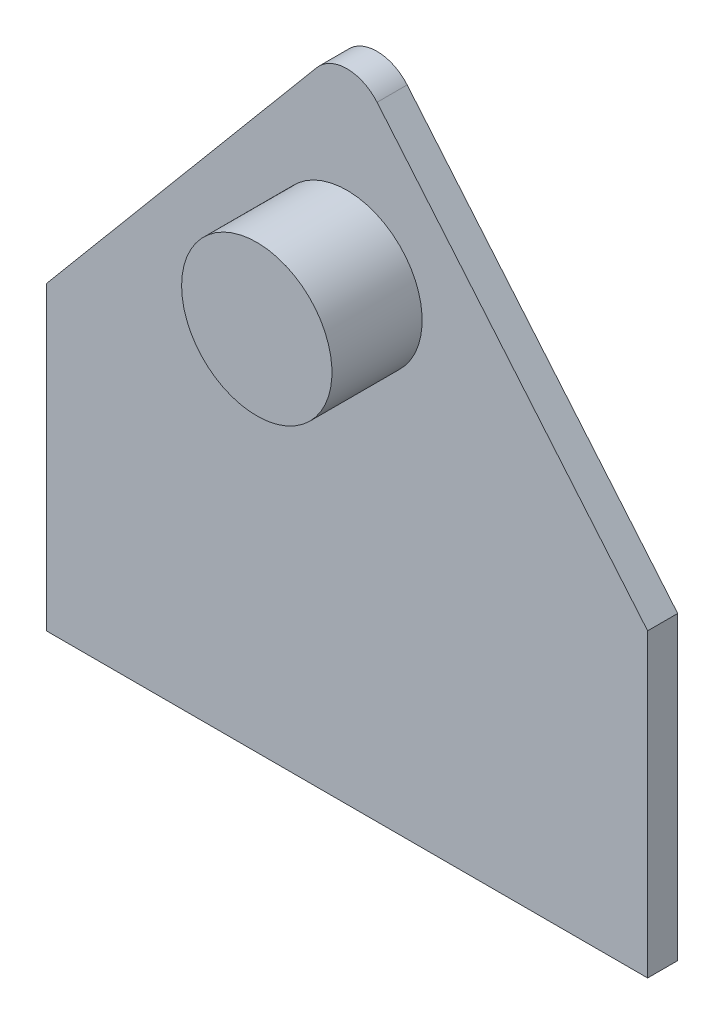
ISO-10303-21;
HEADER;
FILE_DESCRIPTION(('STEP AP214'),'2;1');
FILE_NAME('part.step','',(''),(''),'','','');
FILE_SCHEMA(('AUTOMOTIVE_DESIGN { 1 0 10303 214 1 1 1 1 }'));
ENDSEC;
DATA;
#1=APPLICATION_CONTEXT('core data for automotive mechanical design processes');
#2=APPLICATION_PROTOCOL_DEFINITION('international standard','automotive_design',2000,#1);
#3=PRODUCT_CONTEXT('',#1,'mechanical');
#4=PRODUCT('Part','Part','',(#3));
#5=PRODUCT_RELATED_PRODUCT_CATEGORY('part','',(#4));
#6=PRODUCT_DEFINITION_FORMATION('','',#4);
#7=PRODUCT_DEFINITION_CONTEXT('part definition',#1,'design');
#8=PRODUCT_DEFINITION('design','',#6,#7);
#9=PRODUCT_DEFINITION_SHAPE('','',#8);
#10=(LENGTH_UNIT() NAMED_UNIT(*) SI_UNIT(.MILLI.,.METRE.));
#11=(NAMED_UNIT(*) PLANE_ANGLE_UNIT() SI_UNIT($,.RADIAN.));
#12=(NAMED_UNIT(*) SI_UNIT($,.STERADIAN.) SOLID_ANGLE_UNIT());
#13=UNCERTAINTY_MEASURE_WITH_UNIT(LENGTH_MEASURE(1.E-05),#10,'distance_accuracy_value','');
#14=(GEOMETRIC_REPRESENTATION_CONTEXT(3) GLOBAL_UNCERTAINTY_ASSIGNED_CONTEXT((#13)) GLOBAL_UNIT_ASSIGNED_CONTEXT((#10,
#11,#12)) REPRESENTATION_CONTEXT('',''));
#15=CARTESIAN_POINT('',(0.,0.,0.));
#16=DIRECTION('',(0.,0.,1.));
#17=DIRECTION('',(1.,0.,0.));
#18=AXIS2_PLACEMENT_3D('',#15,#16,#17);
#19=CARTESIAN_POINT('',(15.2005666401944,0.,1.27));
#20=DIRECTION('',(0.,1.,0.));
#21=DIRECTION('',(-1.,0.,0.));
#22=AXIS2_PLACEMENT_3D('',#19,#20,#21);
#23=PLANE('',#22);
#24=DIRECTION('',(1.,0.,0.));
#25=VECTOR('',#24,1.);
#26=CARTESIAN_POINT('',(15.2005666401944,0.,0.));
#27=LINE('',#26,#25);
#28=CARTESIAN_POINT('',(-10.1994333598056,0.,0.));
#29=VERTEX_POINT('',#28);
#30=CARTESIAN_POINT('',(15.2005666401944,0.,0.));
#31=VERTEX_POINT('',#30);
#32=EDGE_CURVE('E141',#29,#31,#27,.T.);
#33=ORIENTED_EDGE('',*,*,#32,.T.);
#34=DIRECTION('',(0.,0.,-1.));
#35=VECTOR('',#34,1.);
#36=CARTESIAN_POINT('',(15.2005666401944,0.,1.27));
#37=LINE('',#36,#35);
#38=CARTESIAN_POINT('',(15.2005666401944,0.,1.27));
#39=VERTEX_POINT('',#38);
#40=EDGE_CURVE('E47',#39,#31,#37,.T.);
#41=ORIENTED_EDGE('',*,*,#40,.F.);
#42=DIRECTION('',(1.,0.,0.));
#43=VECTOR('',#42,1.);
#44=CARTESIAN_POINT('',(15.2005666401944,0.,1.27));
#45=LINE('',#44,#43);
#46=CARTESIAN_POINT('',(-10.1994333598056,0.,1.27));
#47=VERTEX_POINT('',#46);
#48=EDGE_CURVE('E158',#47,#39,#45,.T.);
#49=ORIENTED_EDGE('',*,*,#48,.F.);
#50=DIRECTION('',(0.,0.,-1.));
#51=VECTOR('',#50,1.);
#52=CARTESIAN_POINT('',(-10.1994333598056,0.,1.27));
#53=LINE('',#52,#51);
#54=EDGE_CURVE('E137',#47,#29,#53,.T.);
#55=ORIENTED_EDGE('',*,*,#54,.T.);
#56=EDGE_LOOP('',(#33,#41,#49,#55));
#57=FACE_BOUND('',#56,.T.);
#58=ADVANCED_FACE('F38',(#57),#23,.F.);
#59=CARTESIAN_POINT('',(15.2005666401944,12.7,1.27));
#60=DIRECTION('',(-1.,0.,0.));
#61=DIRECTION('',(0.,0.,1.));
#62=AXIS2_PLACEMENT_3D('',#59,#60,#61);
#63=PLANE('',#62);
#64=DIRECTION('',(0.,1.,0.));
#65=VECTOR('',#64,1.);
#66=CARTESIAN_POINT('',(15.2005666401944,12.7,0.));
#67=LINE('',#66,#65);
#68=CARTESIAN_POINT('',(15.2005666401944,12.7,0.));
#69=VERTEX_POINT('',#68);
#70=EDGE_CURVE('E145',#31,#69,#67,.T.);
#71=ORIENTED_EDGE('',*,*,#70,.T.);
#72=DIRECTION('',(0.,0.,-1.));
#73=VECTOR('',#72,1.);
#74=CARTESIAN_POINT('',(15.2005666401944,12.7,1.27));
#75=LINE('',#74,#73);
#76=CARTESIAN_POINT('',(15.2005666401944,12.7,1.27));
#77=VERTEX_POINT('',#76);
#78=EDGE_CURVE('E165',#77,#69,#75,.T.);
#79=ORIENTED_EDGE('',*,*,#78,.F.);
#80=DIRECTION('',(0.,1.,0.));
#81=VECTOR('',#80,1.);
#82=CARTESIAN_POINT('',(15.2005666401944,12.7,1.27));
#83=LINE('',#82,#81);
#84=EDGE_CURVE('E104',#39,#77,#83,.T.);
#85=ORIENTED_EDGE('',*,*,#84,.F.);
#86=ORIENTED_EDGE('',*,*,#40,.T.);
#87=EDGE_LOOP('',(#71,#79,#85,#86));
#88=FACE_BOUND('',#87,.T.);
#89=ADVANCED_FACE('F171',(#88),#63,.F.);
#90=CARTESIAN_POINT('',(3.77180293996771,26.3202701986554,1.27));
#91=DIRECTION('',(-0.766044443118977,-0.642787609686541,0.));
#92=DIRECTION('',(0.642787609686541,-0.766044443118977,0.));
#93=AXIS2_PLACEMENT_3D('',#90,#91,#92);
#94=PLANE('',#93);
#95=DIRECTION('',(-0.642787609686541,0.766044443118977,0.));
#96=VECTOR('',#95,1.);
#97=CARTESIAN_POINT('',(3.77180293996771,26.3202701986554,0.));
#98=LINE('',#97,#96);
#99=CARTESIAN_POINT('',(3.77180293996771,26.3202701986554,0.));
#100=VERTEX_POINT('',#99);
#101=EDGE_CURVE('E149',#69,#100,#98,.T.);
#102=ORIENTED_EDGE('',*,*,#101,.T.);
#103=DIRECTION('',(0.,0.,-1.));
#104=VECTOR('',#103,1.);
#105=CARTESIAN_POINT('',(3.77180293996771,26.3202701986554,1.27));
#106=LINE('',#105,#104);
#107=CARTESIAN_POINT('',(3.77180293996771,26.3202701986554,1.27));
#108=VERTEX_POINT('',#107);
#109=EDGE_CURVE('E129',#108,#100,#106,.T.);
#110=ORIENTED_EDGE('',*,*,#109,.F.);
#111=DIRECTION('',(-0.642787609686541,0.766044443118977,0.));
#112=VECTOR('',#111,1.);
#113=CARTESIAN_POINT('',(3.77180293996771,26.3202701986554,1.27));
#114=LINE('',#113,#112);
#115=EDGE_CURVE('E118',#77,#108,#114,.T.);
#116=ORIENTED_EDGE('',*,*,#115,.F.);
#117=ORIENTED_EDGE('',*,*,#78,.T.);
#118=EDGE_LOOP('',(#102,#110,#116,#117));
#119=FACE_BOUND('',#118,.T.);
#120=ADVANCED_FACE('F179',(#119),#94,.F.);
#121=CARTESIAN_POINT('',(2.5005666401944,25.2535762883765,1.27));
#122=DIRECTION('',(0.,0.,-1.));
#123=DIRECTION('',(-1.,0.,0.));
#124=AXIS2_PLACEMENT_3D('',#121,#122,#123);
#125=CYLINDRICAL_SURFACE('',#124,1.65948113218787);
#126=CARTESIAN_POINT('',(2.5005666401944,25.2535762883765,0.));
#127=DIRECTION('',(0.,0.,1.));
#128=DIRECTION('',(-1.,0.,0.));
#129=AXIS2_PLACEMENT_3D('',#126,#127,#128);
#130=CIRCLE('',#129,1.65948113218787);
#131=CARTESIAN_POINT('',(1.22933034042109,26.3202701986554,0.));
#132=VERTEX_POINT('',#131);
#133=EDGE_CURVE('E127',#100,#132,#130,.T.);
#134=ORIENTED_EDGE('',*,*,#133,.T.);
#135=DIRECTION('',(0.,0.,-1.));
#136=VECTOR('',#135,1.);
#137=CARTESIAN_POINT('',(1.22933034042109,26.3202701986554,1.27));
#138=LINE('',#137,#136);
#139=CARTESIAN_POINT('',(1.22933034042109,26.3202701986554,1.27));
#140=VERTEX_POINT('',#139);
#141=EDGE_CURVE('E124',#140,#132,#138,.T.);
#142=ORIENTED_EDGE('',*,*,#141,.F.);
#143=CARTESIAN_POINT('',(2.5005666401944,25.2535762883765,1.27));
#144=DIRECTION('',(0.,0.,1.));
#145=DIRECTION('',(-1.,0.,0.));
#146=AXIS2_PLACEMENT_3D('',#143,#144,#145);
#147=CIRCLE('',#146,1.65948113218787);
#148=EDGE_CURVE('E112',#108,#140,#147,.T.);
#149=ORIENTED_EDGE('',*,*,#148,.F.);
#150=ORIENTED_EDGE('',*,*,#109,.T.);
#151=EDGE_LOOP('',(#134,#142,#149,#150));
#152=FACE_BOUND('',#151,.T.);
#153=ADVANCED_FACE('F125',(#152),#125,.T.);
#154=CARTESIAN_POINT('',(-10.1994333598056,12.7,1.27));
#155=DIRECTION('',(0.766044443118977,-0.64278760968654,0.));
#156=DIRECTION('',(0.64278760968654,0.766044443118977,0.));
#157=AXIS2_PLACEMENT_3D('',#154,#155,#156);
#158=PLANE('',#157);
#159=DIRECTION('',(-0.64278760968654,-0.766044443118977,0.));
#160=VECTOR('',#159,1.);
#161=CARTESIAN_POINT('',(-10.1994333598056,12.7,0.));
#162=LINE('',#161,#160);
#163=CARTESIAN_POINT('',(-10.1994333598056,12.7,0.));
#164=VERTEX_POINT('',#163);
#165=EDGE_CURVE('E87',#132,#164,#162,.T.);
#166=ORIENTED_EDGE('',*,*,#165,.T.);
#167=DIRECTION('',(0.,0.,-1.));
#168=VECTOR('',#167,1.);
#169=CARTESIAN_POINT('',(-10.1994333598056,12.7,1.27));
#170=LINE('',#169,#168);
#171=CARTESIAN_POINT('',(-10.1994333598056,12.7,1.27));
#172=VERTEX_POINT('',#171);
#173=EDGE_CURVE('E130',#172,#164,#170,.T.);
#174=ORIENTED_EDGE('',*,*,#173,.F.);
#175=DIRECTION('',(-0.64278760968654,-0.766044443118977,0.));
#176=VECTOR('',#175,1.);
#177=CARTESIAN_POINT('',(-10.1994333598056,12.7,1.27));
#178=LINE('',#177,#176);
#179=EDGE_CURVE('E116',#140,#172,#178,.T.);
#180=ORIENTED_EDGE('',*,*,#179,.F.);
#181=ORIENTED_EDGE('',*,*,#141,.T.);
#182=EDGE_LOOP('',(#166,#174,#180,#181));
#183=FACE_BOUND('',#182,.T.);
#184=ADVANCED_FACE('F132',(#183),#158,.F.);
#185=CARTESIAN_POINT('',(-10.1994333598056,0.,1.27));
#186=DIRECTION('',(1.,0.,0.));
#187=DIRECTION('',(0.,0.,-1.));
#188=AXIS2_PLACEMENT_3D('',#185,#186,#187);
#189=PLANE('',#188);
#190=DIRECTION('',(0.,-1.,0.));
#191=VECTOR('',#190,1.);
#192=CARTESIAN_POINT('',(-10.1994333598056,0.,0.));
#193=LINE('',#192,#191);
#194=EDGE_CURVE('E93',#164,#29,#193,.T.);
#195=ORIENTED_EDGE('',*,*,#194,.T.);
#196=ORIENTED_EDGE('',*,*,#54,.F.);
#197=DIRECTION('',(0.,-1.,0.));
#198=VECTOR('',#197,1.);
#199=CARTESIAN_POINT('',(-10.1994333598056,0.,1.27));
#200=LINE('',#199,#198);
#201=EDGE_CURVE('E57',#172,#47,#200,.T.);
#202=ORIENTED_EDGE('',*,*,#201,.F.);
#203=ORIENTED_EDGE('',*,*,#173,.T.);
#204=EDGE_LOOP('',(#195,#196,#202,#203));
#205=FACE_BOUND('',#204,.T.);
#206=ADVANCED_FACE('F197',(#205),#189,.F.);
#207=CARTESIAN_POINT('',(2.5005666401944,25.2535762883765,1.27));
#208=DIRECTION('',(0.,0.,-1.));
#209=DIRECTION('',(-1.,0.,0.));
#210=AXIS2_PLACEMENT_3D('',#207,#208,#209);
#211=PLANE('',#210);
#212=CARTESIAN_POINT('',(2.5005666401944,19.2930574205643,1.27));
#213=DIRECTION('',(0.,0.,-1.));
#214=DIRECTION('',(-1.,0.,0.));
#215=AXIS2_PLACEMENT_3D('',#212,#213,#214);
#216=CIRCLE('',#215,3.175);
#217=CARTESIAN_POINT('',(-0.674433359805603,19.2930574205643,1.27));
#218=VERTEX_POINT('',#217);
#219=EDGE_CURVE('E11',#218,#218,#216,.F.);
#220=ORIENTED_EDGE('',*,*,#219,.F.);
#221=EDGE_LOOP('',(#220));
#222=FACE_BOUND('',#221,.T.);
#223=ORIENTED_EDGE('',*,*,#48,.T.);
#224=ORIENTED_EDGE('',*,*,#84,.T.);
#225=ORIENTED_EDGE('',*,*,#115,.T.);
#226=ORIENTED_EDGE('',*,*,#148,.T.);
#227=ORIENTED_EDGE('',*,*,#179,.T.);
#228=ORIENTED_EDGE('',*,*,#201,.T.);
#229=EDGE_LOOP('',(#223,#224,#225,#226,#227,#228));
#230=FACE_BOUND('',#229,.T.);
#231=ADVANCED_FACE('F114',(#222,#230),#211,.F.);
#232=CARTESIAN_POINT('',(2.5005666401944,25.2535762883765,0.));
#233=DIRECTION('',(0.,0.,-1.));
#234=DIRECTION('',(-1.,0.,0.));
#235=AXIS2_PLACEMENT_3D('',#232,#233,#234);
#236=PLANE('',#235);
#237=ORIENTED_EDGE('',*,*,#32,.F.);
#238=ORIENTED_EDGE('',*,*,#194,.F.);
#239=ORIENTED_EDGE('',*,*,#165,.F.);
#240=ORIENTED_EDGE('',*,*,#133,.F.);
#241=ORIENTED_EDGE('',*,*,#101,.F.);
#242=ORIENTED_EDGE('',*,*,#70,.F.);
#243=EDGE_LOOP('',(#237,#238,#239,#240,#241,#242));
#244=FACE_BOUND('',#243,.T.);
#245=ADVANCED_FACE('F176',(#244),#236,.T.);
#246=CARTESIAN_POINT('',(2.5005666401944,19.2930574205643,5.08));
#247=DIRECTION('',(0.,0.,-1.));
#248=DIRECTION('',(-1.,0.,0.));
#249=AXIS2_PLACEMENT_3D('',#246,#247,#248);
#250=CYLINDRICAL_SURFACE('',#249,3.175);
#251=CARTESIAN_POINT('',(2.5005666401944,19.2930574205643,5.08));
#252=DIRECTION('',(0.,0.,1.));
#253=DIRECTION('',(1.,0.,0.));
#254=AXIS2_PLACEMENT_3D('',#251,#252,#253);
#255=CIRCLE('',#254,3.175);
#256=CARTESIAN_POINT('',(-0.674433359805603,19.2930574205643,5.08));
#257=VERTEX_POINT('',#256);
#258=EDGE_CURVE('E146',#257,#257,#255,.T.);
#259=CARTESIAN_POINT('',(-0.674433359805603,19.2930574205643,5.08));
#260=CARTESIAN_POINT('',(-0.674433359805603,19.2930574205643,5.0403125));
#261=CARTESIAN_POINT('',(-0.674433359805603,19.2930574205643,5.000625));
#262=CARTESIAN_POINT('',(-0.674433359805603,19.2930574205643,4.92125));
#263=CARTESIAN_POINT('',(-0.674433359805603,19.2930574205643,4.8815625));
#264=CARTESIAN_POINT('',(-0.674433359805603,19.2930574205643,4.8021875));
#265=CARTESIAN_POINT('',(-0.674433359805603,19.2930574205643,4.7625));
#266=CARTESIAN_POINT('',(-0.674433359805603,19.2930574205643,4.683125));
#267=CARTESIAN_POINT('',(-0.674433359805603,19.2930574205643,4.6434375));
#268=CARTESIAN_POINT('',(-0.674433359805603,19.2930574205643,4.5640625));
#269=CARTESIAN_POINT('',(-0.674433359805603,19.2930574205643,4.524375));
#270=CARTESIAN_POINT('',(-0.674433359805603,19.2930574205643,4.445));
#271=CARTESIAN_POINT('',(-0.674433359805603,19.2930574205643,4.4053125));
#272=CARTESIAN_POINT('',(-0.674433359805603,19.2930574205643,4.3259375));
#273=CARTESIAN_POINT('',(-0.674433359805603,19.2930574205643,4.28625));
#274=CARTESIAN_POINT('',(-0.674433359805603,19.2930574205643,4.206875));
#275=CARTESIAN_POINT('',(-0.674433359805603,19.2930574205643,4.1671875));
#276=CARTESIAN_POINT('',(-0.674433359805603,19.2930574205643,4.0878125));
#277=CARTESIAN_POINT('',(-0.674433359805603,19.2930574205643,4.048125));
#278=CARTESIAN_POINT('',(-0.674433359805603,19.2930574205643,3.96875));
#279=CARTESIAN_POINT('',(-0.674433359805603,19.2930574205643,3.9290625));
#280=CARTESIAN_POINT('',(-0.674433359805603,19.2930574205643,3.8496875));
#281=CARTESIAN_POINT('',(-0.674433359805603,19.2930574205643,3.81));
#282=CARTESIAN_POINT('',(-0.674433359805603,19.2930574205643,3.730625));
#283=CARTESIAN_POINT('',(-0.674433359805603,19.2930574205643,3.6909375));
#284=CARTESIAN_POINT('',(-0.674433359805603,19.2930574205643,3.6115625));
#285=CARTESIAN_POINT('',(-0.674433359805603,19.2930574205643,3.571875));
#286=CARTESIAN_POINT('',(-0.674433359805603,19.2930574205643,3.4925));
#287=CARTESIAN_POINT('',(-0.674433359805603,19.2930574205643,3.4528125));
#288=CARTESIAN_POINT('',(-0.674433359805603,19.2930574205643,3.3734375));
#289=CARTESIAN_POINT('',(-0.674433359805603,19.2930574205643,3.33375));
#290=CARTESIAN_POINT('',(-0.674433359805603,19.2930574205643,3.254375));
#291=CARTESIAN_POINT('',(-0.674433359805603,19.2930574205643,3.2146875));
#292=CARTESIAN_POINT('',(-0.674433359805603,19.2930574205643,3.1353125));
#293=CARTESIAN_POINT('',(-0.674433359805603,19.2930574205643,3.095625));
#294=CARTESIAN_POINT('',(-0.674433359805603,19.2930574205643,3.01625));
#295=CARTESIAN_POINT('',(-0.674433359805603,19.2930574205643,2.9765625));
#296=CARTESIAN_POINT('',(-0.674433359805603,19.2930574205643,2.8971875));
#297=CARTESIAN_POINT('',(-0.674433359805603,19.2930574205643,2.8575));
#298=CARTESIAN_POINT('',(-0.674433359805603,19.2930574205643,2.778125));
#299=CARTESIAN_POINT('',(-0.674433359805603,19.2930574205643,2.7384375));
#300=CARTESIAN_POINT('',(-0.674433359805603,19.2930574205643,2.6590625));
#301=CARTESIAN_POINT('',(-0.674433359805603,19.2930574205643,2.619375));
#302=CARTESIAN_POINT('',(-0.674433359805603,19.2930574205643,2.54));
#303=CARTESIAN_POINT('',(-0.674433359805603,19.2930574205643,2.5003125));
#304=CARTESIAN_POINT('',(-0.674433359805603,19.2930574205643,2.4209375));
#305=CARTESIAN_POINT('',(-0.674433359805603,19.2930574205643,2.38125));
#306=CARTESIAN_POINT('',(-0.674433359805603,19.2930574205643,2.301875));
#307=CARTESIAN_POINT('',(-0.674433359805603,19.2930574205643,2.2621875));
#308=CARTESIAN_POINT('',(-0.674433359805603,19.2930574205643,2.1828125));
#309=CARTESIAN_POINT('',(-0.674433359805603,19.2930574205643,2.143125));
#310=CARTESIAN_POINT('',(-0.674433359805603,19.2930574205643,2.06375));
#311=CARTESIAN_POINT('',(-0.674433359805603,19.2930574205643,2.0240625));
#312=CARTESIAN_POINT('',(-0.674433359805603,19.2930574205643,1.9446875));
#313=CARTESIAN_POINT('',(-0.674433359805603,19.2930574205643,1.905));
#314=CARTESIAN_POINT('',(-0.674433359805603,19.2930574205643,1.825625));
#315=CARTESIAN_POINT('',(-0.674433359805603,19.2930574205643,1.7859375));
#316=CARTESIAN_POINT('',(-0.674433359805603,19.2930574205643,1.7065625));
#317=CARTESIAN_POINT('',(-0.674433359805603,19.2930574205643,1.666875));
#318=CARTESIAN_POINT('',(-0.674433359805603,19.2930574205643,1.5875));
#319=CARTESIAN_POINT('',(-0.674433359805603,19.2930574205643,1.5478125));
#320=CARTESIAN_POINT('',(-0.674433359805603,19.2930574205643,1.4684375));
#321=CARTESIAN_POINT('',(-0.674433359805603,19.2930574205643,1.42875));
#322=CARTESIAN_POINT('',(-0.674433359805603,19.2930574205643,1.349375));
#323=CARTESIAN_POINT('',(-0.674433359805603,19.2930574205643,1.3096875));
#324=CARTESIAN_POINT('',(-0.674433359805603,19.2930574205643,1.27));
#325=B_SPLINE_CURVE_WITH_KNOTS('',3,(#259,#260,#261,#262,#263,#264,#265,#266,#267,#268,#269,
#270,#271,#272,#273,#274,#275,#276,#277,#278,#279,#280,#281,#282,#283,#284,#285,#286,#287,#288,
#289,#290,#291,#292,#293,#294,#295,#296,#297,#298,#299,#300,#301,#302,#303,#304,#305,#306,#307,
#308,#309,#310,#311,#312,#313,#314,#315,#316,#317,#318,#319,#320,#321,#322,#323,#324),
.UNSPECIFIED.,.F.,.F.,(4,2,2,2,2,2,2,2,2,2,2,2,2,2,2,2,2,2,2,2,2,2,2,2,2,2,2,2,2,2,2,2,4),(0.,
0.119062499999999,0.238125,0.357187499999999,0.476249999999999,0.595312499999999,
0.714374999999999,0.833437499999999,0.952499999999999,1.0715625,1.190625,1.3096875,1.42875,
1.5478125,1.666875,1.7859375,1.905,2.0240625,2.143125,2.2621875,2.38125,2.5003125,2.619375,
2.7384375,2.8575,2.9765625,3.095625,3.2146875,3.33375,3.4528125,3.571875,3.6909375,3.81),.UNSPECIFIED.);
#326=EDGE_CURVE('BSEAM190',#257,#218,#325,.T.);
#327=ORIENTED_EDGE('',*,*,#258,.F.);
#328=ORIENTED_EDGE('',*,*,#219,.T.);
#329=ORIENTED_EDGE('',*,*,#326,.T.);
#330=ORIENTED_EDGE('',*,*,#326,.F.);
#331=EDGE_LOOP('',(#327,#329,#328,#330));
#332=FACE_BOUND('',#331,.T.);
#333=ADVANCED_FACE('F190',(#332),#250,.T.);
#334=CARTESIAN_POINT('',(2.5005666401944,19.2930574205643,5.08));
#335=DIRECTION('',(0.,0.,1.));
#336=DIRECTION('',(1.,0.,0.));
#337=AXIS2_PLACEMENT_3D('',#334,#335,#336);
#338=PLANE('',#337);
#339=ORIENTED_EDGE('',*,*,#258,.T.);
#340=EDGE_LOOP('',(#339));
#341=FACE_BOUND('',#340,.T.);
#342=ADVANCED_FACE('F188',(#341),#338,.T.);
#343=CLOSED_SHELL('',(#58,#89,#120,#153,#184,#206,#231,#245,#333,#342));
#344=MANIFOLD_SOLID_BREP('B2',#343);
#345=ADVANCED_BREP_SHAPE_REPRESENTATION('',(#18,#344),#14);
#346=SHAPE_DEFINITION_REPRESENTATION(#9,#345);
ENDSEC;
END-ISO-10303-21;
